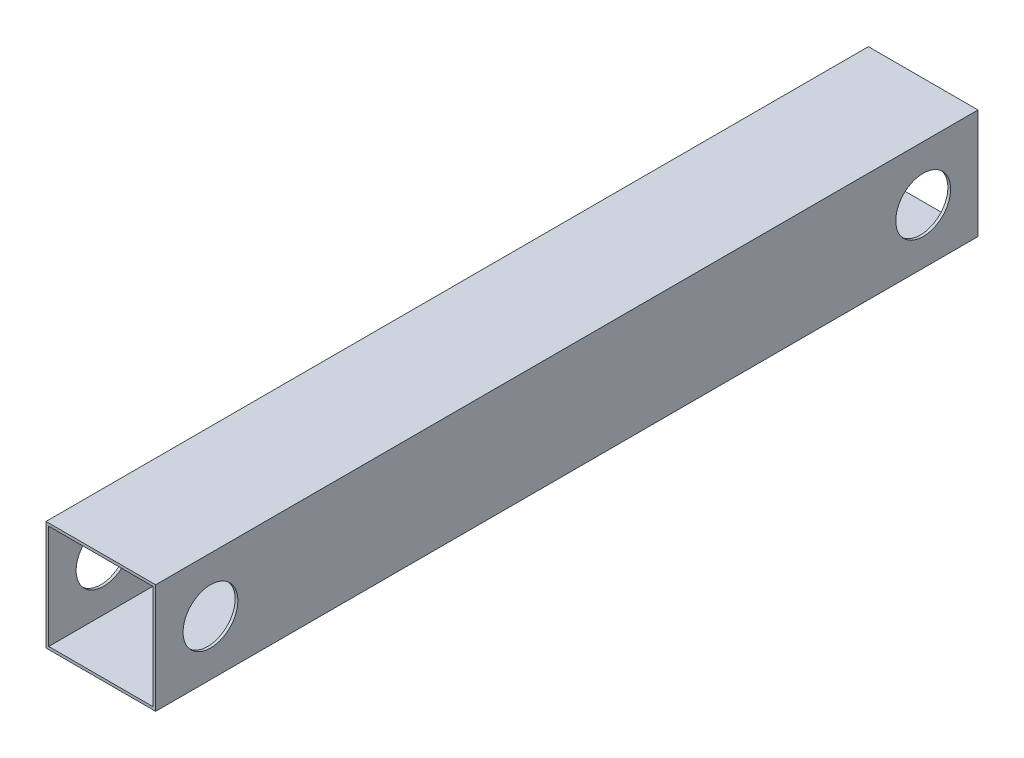
ISO-10303-21;
HEADER;
FILE_DESCRIPTION(('STEP AP214'),'2;1');
FILE_NAME('part.step','',(''),(''),'','','');
FILE_SCHEMA(('AUTOMOTIVE_DESIGN { 1 0 10303 214 1 1 1 1 }'));
ENDSEC;
DATA;
#1=APPLICATION_CONTEXT('core data for automotive mechanical design processes');
#2=APPLICATION_PROTOCOL_DEFINITION('international standard','automotive_design',2000,#1);
#3=PRODUCT_CONTEXT('',#1,'mechanical');
#4=PRODUCT('Part','Part','',(#3));
#5=PRODUCT_RELATED_PRODUCT_CATEGORY('part','',(#4));
#6=PRODUCT_DEFINITION_FORMATION('','',#4);
#7=PRODUCT_DEFINITION_CONTEXT('part definition',#1,'design');
#8=PRODUCT_DEFINITION('design','',#6,#7);
#9=PRODUCT_DEFINITION_SHAPE('','',#8);
#10=(LENGTH_UNIT() NAMED_UNIT(*) SI_UNIT(.MILLI.,.METRE.));
#11=(NAMED_UNIT(*) PLANE_ANGLE_UNIT() SI_UNIT($,.RADIAN.));
#12=(NAMED_UNIT(*) SI_UNIT($,.STERADIAN.) SOLID_ANGLE_UNIT());
#13=UNCERTAINTY_MEASURE_WITH_UNIT(LENGTH_MEASURE(1.E-05),#10,'distance_accuracy_value','');
#14=(GEOMETRIC_REPRESENTATION_CONTEXT(3) GLOBAL_UNCERTAINTY_ASSIGNED_CONTEXT((#13)) GLOBAL_UNIT_ASSIGNED_CONTEXT((#10,
#11,#12)) REPRESENTATION_CONTEXT('',''));
#15=CARTESIAN_POINT('',(0.,0.,0.));
#16=DIRECTION('',(0.,0.,1.));
#17=DIRECTION('',(1.,0.,0.));
#18=AXIS2_PLACEMENT_3D('',#15,#16,#17);
#19=CARTESIAN_POINT('',(0.,0.,150.));
#20=DIRECTION('',(0.,0.,-1.));
#21=DIRECTION('',(-1.,0.,0.));
#22=AXIS2_PLACEMENT_3D('',#19,#20,#21);
#23=PLANE('',#22);
#24=DIRECTION('',(0.,1.,0.));
#25=VECTOR('',#24,1.);
#26=CARTESIAN_POINT('',(10.,-10.,150.));
#27=LINE('',#26,#25);
#28=CARTESIAN_POINT('',(10.,-10.,150.));
#29=VERTEX_POINT('',#28);
#30=CARTESIAN_POINT('',(10.,10.,150.));
#31=VERTEX_POINT('',#30);
#32=EDGE_CURVE('E157',#29,#31,#27,.T.);
#33=ORIENTED_EDGE('',*,*,#32,.T.);
#34=DIRECTION('',(-1.,0.,0.));
#35=VECTOR('',#34,1.);
#36=CARTESIAN_POINT('',(-10.,10.,150.));
#37=LINE('',#36,#35);
#38=CARTESIAN_POINT('',(-10.,10.,150.));
#39=VERTEX_POINT('',#38);
#40=EDGE_CURVE('E161',#31,#39,#37,.T.);
#41=ORIENTED_EDGE('',*,*,#40,.T.);
#42=DIRECTION('',(0.,-1.,0.));
#43=VECTOR('',#42,1.);
#44=CARTESIAN_POINT('',(-10.,-10.,150.));
#45=LINE('',#44,#43);
#46=CARTESIAN_POINT('',(-10.,-10.,150.));
#47=VERTEX_POINT('',#46);
#48=EDGE_CURVE('E165',#39,#47,#45,.T.);
#49=ORIENTED_EDGE('',*,*,#48,.T.);
#50=DIRECTION('',(1.,0.,0.));
#51=VECTOR('',#50,1.);
#52=CARTESIAN_POINT('',(-10.,-10.,150.));
#53=LINE('',#52,#51);
#54=EDGE_CURVE('E168',#47,#29,#53,.T.);
#55=ORIENTED_EDGE('',*,*,#54,.T.);
#56=EDGE_LOOP('',(#33,#41,#49,#55));
#57=FACE_BOUND('',#56,.T.);
#58=DIRECTION('',(0.,1.,0.));
#59=VECTOR('',#58,1.);
#60=CARTESIAN_POINT('',(9.5,-9.5,150.));
#61=LINE('',#60,#59);
#62=CARTESIAN_POINT('',(9.5,-9.5,150.));
#63=VERTEX_POINT('',#62);
#64=CARTESIAN_POINT('',(9.5,9.5,150.));
#65=VERTEX_POINT('',#64);
#66=EDGE_CURVE('E107',#63,#65,#61,.T.);
#67=ORIENTED_EDGE('',*,*,#66,.F.);
#68=DIRECTION('',(1.,0.,0.));
#69=VECTOR('',#68,1.);
#70=CARTESIAN_POINT('',(-9.5,-9.5,150.));
#71=LINE('',#70,#69);
#72=CARTESIAN_POINT('',(-9.5,-9.5,150.));
#73=VERTEX_POINT('',#72);
#74=EDGE_CURVE('E133',#73,#63,#71,.T.);
#75=ORIENTED_EDGE('',*,*,#74,.F.);
#76=DIRECTION('',(0.,-1.,0.));
#77=VECTOR('',#76,1.);
#78=CARTESIAN_POINT('',(-9.5,-9.5,150.));
#79=LINE('',#78,#77);
#80=CARTESIAN_POINT('',(-9.5,9.5,150.));
#81=VERTEX_POINT('',#80);
#82=EDGE_CURVE('E129',#81,#73,#79,.T.);
#83=ORIENTED_EDGE('',*,*,#82,.F.);
#84=DIRECTION('',(-1.,0.,0.));
#85=VECTOR('',#84,1.);
#86=CARTESIAN_POINT('',(-9.5,9.5,150.));
#87=LINE('',#86,#85);
#88=EDGE_CURVE('E116',#65,#81,#87,.T.);
#89=ORIENTED_EDGE('',*,*,#88,.F.);
#90=EDGE_LOOP('',(#67,#75,#83,#89));
#91=FACE_BOUND('',#90,.T.);
#92=ADVANCED_FACE('F39',(#57,#91),#23,.F.);
#93=CARTESIAN_POINT('',(0.,0.,0.));
#94=DIRECTION('',(0.,0.,-1.));
#95=DIRECTION('',(-1.,0.,0.));
#96=AXIS2_PLACEMENT_3D('',#93,#94,#95);
#97=PLANE('',#96);
#98=DIRECTION('',(0.,1.,0.));
#99=VECTOR('',#98,1.);
#100=CARTESIAN_POINT('',(10.,-10.,0.));
#101=LINE('',#100,#99);
#102=CARTESIAN_POINT('',(10.,-10.,0.));
#103=VERTEX_POINT('',#102);
#104=CARTESIAN_POINT('',(10.,10.,0.));
#105=VERTEX_POINT('',#104);
#106=EDGE_CURVE('E125',#103,#105,#101,.T.);
#107=ORIENTED_EDGE('',*,*,#106,.F.);
#108=DIRECTION('',(1.,0.,0.));
#109=VECTOR('',#108,1.);
#110=CARTESIAN_POINT('',(-10.,-10.,0.));
#111=LINE('',#110,#109);
#112=CARTESIAN_POINT('',(-10.,-10.,0.));
#113=VERTEX_POINT('',#112);
#114=EDGE_CURVE('E162',#113,#103,#111,.T.);
#115=ORIENTED_EDGE('',*,*,#114,.F.);
#116=DIRECTION('',(0.,-1.,0.));
#117=VECTOR('',#116,1.);
#118=CARTESIAN_POINT('',(-10.,-10.,0.));
#119=LINE('',#118,#117);
#120=CARTESIAN_POINT('',(-10.,10.,0.));
#121=VERTEX_POINT('',#120);
#122=EDGE_CURVE('E178',#121,#113,#119,.T.);
#123=ORIENTED_EDGE('',*,*,#122,.F.);
#124=DIRECTION('',(-1.,0.,0.));
#125=VECTOR('',#124,1.);
#126=CARTESIAN_POINT('',(-10.,10.,0.));
#127=LINE('',#126,#125);
#128=EDGE_CURVE('E175',#105,#121,#127,.T.);
#129=ORIENTED_EDGE('',*,*,#128,.F.);
#130=EDGE_LOOP('',(#107,#115,#123,#129));
#131=FACE_BOUND('',#130,.T.);
#132=DIRECTION('',(1.,0.,0.));
#133=VECTOR('',#132,1.);
#134=CARTESIAN_POINT('',(-9.5,-9.5,0.));
#135=LINE('',#134,#133);
#136=CARTESIAN_POINT('',(-9.5,-9.5,0.));
#137=VERTEX_POINT('',#136);
#138=CARTESIAN_POINT('',(9.5,-9.5,0.));
#139=VERTEX_POINT('',#138);
#140=EDGE_CURVE('E117',#137,#139,#135,.T.);
#141=ORIENTED_EDGE('',*,*,#140,.T.);
#142=DIRECTION('',(0.,1.,0.));
#143=VECTOR('',#142,1.);
#144=CARTESIAN_POINT('',(9.5,-9.5,0.));
#145=LINE('',#144,#143);
#146=CARTESIAN_POINT('',(9.5,9.5,0.));
#147=VERTEX_POINT('',#146);
#148=EDGE_CURVE('E65',#139,#147,#145,.T.);
#149=ORIENTED_EDGE('',*,*,#148,.T.);
#150=DIRECTION('',(-1.,0.,0.));
#151=VECTOR('',#150,1.);
#152=CARTESIAN_POINT('',(-9.5,9.5,0.));
#153=LINE('',#152,#151);
#154=CARTESIAN_POINT('',(-9.5,9.5,0.));
#155=VERTEX_POINT('',#154);
#156=EDGE_CURVE('E123',#147,#155,#153,.T.);
#157=ORIENTED_EDGE('',*,*,#156,.T.);
#158=DIRECTION('',(0.,-1.,0.));
#159=VECTOR('',#158,1.);
#160=CARTESIAN_POINT('',(-9.5,-9.5,0.));
#161=LINE('',#160,#159);
#162=EDGE_CURVE('E144',#155,#137,#161,.T.);
#163=ORIENTED_EDGE('',*,*,#162,.T.);
#164=EDGE_LOOP('',(#141,#149,#157,#163));
#165=FACE_BOUND('',#164,.T.);
#166=ADVANCED_FACE('F244',(#131,#165),#97,.T.);
#167=CARTESIAN_POINT('',(10.,-10.,150.));
#168=DIRECTION('',(-1.,0.,0.));
#169=DIRECTION('',(0.,0.,1.));
#170=AXIS2_PLACEMENT_3D('',#167,#168,#169);
#171=PLANE('',#170);
#172=CARTESIAN_POINT('',(10.,0.,140.));
#173=DIRECTION('',(1.,0.,0.));
#174=DIRECTION('',(0.,0.,-1.));
#175=AXIS2_PLACEMENT_3D('',#172,#173,#174);
#176=CIRCLE('',#175,4.99999999999999);
#177=CARTESIAN_POINT('',(10.,0.,135.));
#178=VERTEX_POINT('',#177);
#179=EDGE_CURVE('E196',#178,#178,#176,.T.);
#180=ORIENTED_EDGE('',*,*,#179,.F.);
#181=EDGE_LOOP('',(#180));
#182=FACE_BOUND('',#181,.T.);
#183=CARTESIAN_POINT('',(10.,0.,10.));
#184=DIRECTION('',(1.,0.,0.));
#185=DIRECTION('',(0.,0.,1.));
#186=AXIS2_PLACEMENT_3D('',#183,#184,#185);
#187=CIRCLE('',#186,4.99999999999999);
#188=CARTESIAN_POINT('',(10.,0.,15.));
#189=VERTEX_POINT('',#188);
#190=EDGE_CURVE('E205',#189,#189,#187,.T.);
#191=ORIENTED_EDGE('',*,*,#190,.F.);
#192=EDGE_LOOP('',(#191));
#193=FACE_BOUND('',#192,.T.);
#194=ORIENTED_EDGE('',*,*,#106,.T.);
#195=DIRECTION('',(0.,0.,-1.));
#196=VECTOR('',#195,1.);
#197=CARTESIAN_POINT('',(10.,10.,150.));
#198=LINE('',#197,#196);
#199=EDGE_CURVE('E11',#31,#105,#198,.T.);
#200=ORIENTED_EDGE('',*,*,#199,.F.);
#201=ORIENTED_EDGE('',*,*,#32,.F.);
#202=DIRECTION('',(0.,0.,-1.));
#203=VECTOR('',#202,1.);
#204=CARTESIAN_POINT('',(10.,-10.,150.));
#205=LINE('',#204,#203);
#206=EDGE_CURVE('E171',#29,#103,#205,.T.);
#207=ORIENTED_EDGE('',*,*,#206,.T.);
#208=EDGE_LOOP('',(#194,#200,#201,#207));
#209=FACE_BOUND('',#208,.T.);
#210=ADVANCED_FACE('F41',(#182,#193,#209),#171,.F.);
#211=CARTESIAN_POINT('',(-10.,10.,150.));
#212=DIRECTION('',(0.,-1.,0.));
#213=DIRECTION('',(0.,0.,-1.));
#214=AXIS2_PLACEMENT_3D('',#211,#212,#213);
#215=PLANE('',#214);
#216=ORIENTED_EDGE('',*,*,#128,.T.);
#217=DIRECTION('',(0.,0.,-1.));
#218=VECTOR('',#217,1.);
#219=CARTESIAN_POINT('',(-10.,10.,150.));
#220=LINE('',#219,#218);
#221=EDGE_CURVE('E49',#39,#121,#220,.T.);
#222=ORIENTED_EDGE('',*,*,#221,.F.);
#223=ORIENTED_EDGE('',*,*,#40,.F.);
#224=ORIENTED_EDGE('',*,*,#199,.T.);
#225=EDGE_LOOP('',(#216,#222,#223,#224));
#226=FACE_BOUND('',#225,.T.);
#227=ADVANCED_FACE('F260',(#226),#215,.F.);
#228=CARTESIAN_POINT('',(-10.,-10.,150.));
#229=DIRECTION('',(1.,0.,0.));
#230=DIRECTION('',(0.,0.,-1.));
#231=AXIS2_PLACEMENT_3D('',#228,#229,#230);
#232=PLANE('',#231);
#233=CARTESIAN_POINT('',(-10.,0.,140.));
#234=DIRECTION('',(1.,0.,0.));
#235=DIRECTION('',(0.,0.,-1.));
#236=AXIS2_PLACEMENT_3D('',#233,#234,#235);
#237=CIRCLE('',#236,4.99999999999999);
#238=CARTESIAN_POINT('',(-10.,0.,135.));
#239=VERTEX_POINT('',#238);
#240=EDGE_CURVE('E141',#239,#239,#237,.T.);
#241=ORIENTED_EDGE('',*,*,#240,.T.);
#242=EDGE_LOOP('',(#241));
#243=FACE_BOUND('',#242,.T.);
#244=CARTESIAN_POINT('',(-10.,0.,10.));
#245=DIRECTION('',(1.,0.,0.));
#246=DIRECTION('',(0.,0.,-1.));
#247=AXIS2_PLACEMENT_3D('',#244,#245,#246);
#248=CIRCLE('',#247,4.99999999999999);
#249=CARTESIAN_POINT('',(-10.,0.,5.00000000000002));
#250=VERTEX_POINT('',#249);
#251=EDGE_CURVE('E202',#250,#250,#248,.T.);
#252=ORIENTED_EDGE('',*,*,#251,.T.);
#253=EDGE_LOOP('',(#252));
#254=FACE_BOUND('',#253,.T.);
#255=ORIENTED_EDGE('',*,*,#122,.T.);
#256=DIRECTION('',(0.,0.,-1.));
#257=VECTOR('',#256,1.);
#258=CARTESIAN_POINT('',(-10.,-10.,150.));
#259=LINE('',#258,#257);
#260=EDGE_CURVE('E186',#47,#113,#259,.T.);
#261=ORIENTED_EDGE('',*,*,#260,.F.);
#262=ORIENTED_EDGE('',*,*,#48,.F.);
#263=ORIENTED_EDGE('',*,*,#221,.T.);
#264=EDGE_LOOP('',(#255,#261,#262,#263));
#265=FACE_BOUND('',#264,.T.);
#266=ADVANCED_FACE('F223',(#243,#254,#265),#232,.F.);
#267=CARTESIAN_POINT('',(-10.,-10.,150.));
#268=DIRECTION('',(0.,1.,0.));
#269=DIRECTION('',(0.,0.,1.));
#270=AXIS2_PLACEMENT_3D('',#267,#268,#269);
#271=PLANE('',#270);
#272=ORIENTED_EDGE('',*,*,#114,.T.);
#273=ORIENTED_EDGE('',*,*,#206,.F.);
#274=ORIENTED_EDGE('',*,*,#54,.F.);
#275=ORIENTED_EDGE('',*,*,#260,.T.);
#276=EDGE_LOOP('',(#272,#273,#274,#275));
#277=FACE_BOUND('',#276,.T.);
#278=ADVANCED_FACE('F255',(#277),#271,.F.);
#279=CARTESIAN_POINT('',(9.5,-9.5,150.));
#280=DIRECTION('',(-1.,0.,0.));
#281=DIRECTION('',(0.,0.,1.));
#282=AXIS2_PLACEMENT_3D('',#279,#280,#281);
#283=PLANE('',#282);
#284=CARTESIAN_POINT('',(9.50000000000001,0.,140.));
#285=DIRECTION('',(-1.,0.,0.));
#286=DIRECTION('',(0.,0.,1.));
#287=AXIS2_PLACEMENT_3D('',#284,#285,#286);
#288=CIRCLE('',#287,4.99999999999999);
#289=CARTESIAN_POINT('',(9.50000000000001,0.,145.));
#290=VERTEX_POINT('',#289);
#291=EDGE_CURVE('E216',#290,#290,#288,.T.);
#292=ORIENTED_EDGE('',*,*,#291,.F.);
#293=EDGE_LOOP('',(#292));
#294=FACE_BOUND('',#293,.T.);
#295=CARTESIAN_POINT('',(9.50000000000001,0.,10.));
#296=DIRECTION('',(-1.,0.,0.));
#297=DIRECTION('',(0.,0.,1.));
#298=AXIS2_PLACEMENT_3D('',#295,#296,#297);
#299=CIRCLE('',#298,4.99999999999999);
#300=CARTESIAN_POINT('',(9.50000000000001,0.,15.));
#301=VERTEX_POINT('',#300);
#302=EDGE_CURVE('E195',#301,#301,#299,.T.);
#303=ORIENTED_EDGE('',*,*,#302,.F.);
#304=EDGE_LOOP('',(#303));
#305=FACE_BOUND('',#304,.T.);
#306=ORIENTED_EDGE('',*,*,#148,.F.);
#307=DIRECTION('',(0.,0.,-1.));
#308=VECTOR('',#307,1.);
#309=CARTESIAN_POINT('',(9.5,-9.5,150.));
#310=LINE('',#309,#308);
#311=EDGE_CURVE('E111',#63,#139,#310,.T.);
#312=ORIENTED_EDGE('',*,*,#311,.F.);
#313=ORIENTED_EDGE('',*,*,#66,.T.);
#314=DIRECTION('',(0.,0.,-1.));
#315=VECTOR('',#314,1.);
#316=CARTESIAN_POINT('',(9.5,9.5,150.));
#317=LINE('',#316,#315);
#318=EDGE_CURVE('E110',#65,#147,#317,.T.);
#319=ORIENTED_EDGE('',*,*,#318,.T.);
#320=EDGE_LOOP('',(#306,#312,#313,#319));
#321=FACE_BOUND('',#320,.T.);
#322=ADVANCED_FACE('F109',(#294,#305,#321),#283,.T.);
#323=CARTESIAN_POINT('',(-9.5,9.5,150.));
#324=DIRECTION('',(0.,-1.,0.));
#325=DIRECTION('',(0.,0.,-1.));
#326=AXIS2_PLACEMENT_3D('',#323,#324,#325);
#327=PLANE('',#326);
#328=ORIENTED_EDGE('',*,*,#156,.F.);
#329=ORIENTED_EDGE('',*,*,#318,.F.);
#330=ORIENTED_EDGE('',*,*,#88,.T.);
#331=DIRECTION('',(0.,0.,-1.));
#332=VECTOR('',#331,1.);
#333=CARTESIAN_POINT('',(-9.5,9.5,150.));
#334=LINE('',#333,#332);
#335=EDGE_CURVE('E126',#81,#155,#334,.T.);
#336=ORIENTED_EDGE('',*,*,#335,.T.);
#337=EDGE_LOOP('',(#328,#329,#330,#336));
#338=FACE_BOUND('',#337,.T.);
#339=ADVANCED_FACE('F120',(#338),#327,.T.);
#340=CARTESIAN_POINT('',(-9.5,-9.5,150.));
#341=DIRECTION('',(1.,0.,0.));
#342=DIRECTION('',(0.,0.,-1.));
#343=AXIS2_PLACEMENT_3D('',#340,#341,#342);
#344=PLANE('',#343);
#345=CARTESIAN_POINT('',(-9.50000000000001,0.,140.));
#346=DIRECTION('',(1.,0.,0.));
#347=DIRECTION('',(0.,0.,-1.));
#348=AXIS2_PLACEMENT_3D('',#345,#346,#347);
#349=CIRCLE('',#348,4.99999999999999);
#350=CARTESIAN_POINT('',(-9.50000000000001,0.,135.));
#351=VERTEX_POINT('',#350);
#352=EDGE_CURVE('E43',#351,#351,#349,.T.);
#353=ORIENTED_EDGE('',*,*,#352,.F.);
#354=EDGE_LOOP('',(#353));
#355=FACE_BOUND('',#354,.T.);
#356=CARTESIAN_POINT('',(-9.50000000000001,0.,10.));
#357=DIRECTION('',(1.,0.,0.));
#358=DIRECTION('',(0.,0.,-1.));
#359=AXIS2_PLACEMENT_3D('',#356,#357,#358);
#360=CIRCLE('',#359,4.99999999999999);
#361=CARTESIAN_POINT('',(-9.50000000000001,0.,5.00000000000002));
#362=VERTEX_POINT('',#361);
#363=EDGE_CURVE('E192',#362,#362,#360,.T.);
#364=ORIENTED_EDGE('',*,*,#363,.F.);
#365=EDGE_LOOP('',(#364));
#366=FACE_BOUND('',#365,.T.);
#367=ORIENTED_EDGE('',*,*,#162,.F.);
#368=ORIENTED_EDGE('',*,*,#335,.F.);
#369=ORIENTED_EDGE('',*,*,#82,.T.);
#370=DIRECTION('',(0.,0.,-1.));
#371=VECTOR('',#370,1.);
#372=CARTESIAN_POINT('',(-9.5,-9.5,150.));
#373=LINE('',#372,#371);
#374=EDGE_CURVE('E57',#73,#137,#373,.T.);
#375=ORIENTED_EDGE('',*,*,#374,.T.);
#376=EDGE_LOOP('',(#367,#368,#369,#375));
#377=FACE_BOUND('',#376,.T.);
#378=ADVANCED_FACE('F282',(#355,#366,#377),#344,.T.);
#379=CARTESIAN_POINT('',(-9.5,-9.5,150.));
#380=DIRECTION('',(0.,1.,0.));
#381=DIRECTION('',(0.,0.,1.));
#382=AXIS2_PLACEMENT_3D('',#379,#380,#381);
#383=PLANE('',#382);
#384=ORIENTED_EDGE('',*,*,#140,.F.);
#385=ORIENTED_EDGE('',*,*,#374,.F.);
#386=ORIENTED_EDGE('',*,*,#74,.T.);
#387=ORIENTED_EDGE('',*,*,#311,.T.);
#388=EDGE_LOOP('',(#384,#385,#386,#387));
#389=FACE_BOUND('',#388,.T.);
#390=ADVANCED_FACE('F239',(#389),#383,.T.);
#391=CARTESIAN_POINT('',(-140.,0.,10.));
#392=DIRECTION('',(1.,0.,0.));
#393=DIRECTION('',(0.,0.,-1.));
#394=AXIS2_PLACEMENT_3D('',#391,#392,#393);
#395=CYLINDRICAL_SURFACE('',#394,4.99999999999999);
#396=ORIENTED_EDGE('',*,*,#363,.T.);
#397=EDGE_LOOP('',(#396));
#398=FACE_BOUND('',#397,.T.);
#399=ORIENTED_EDGE('',*,*,#251,.F.);
#400=EDGE_LOOP('',(#399));
#401=FACE_BOUND('',#400,.T.);
#402=ADVANCED_FACE('F229',(#398,#401),#395,.F.);
#403=CARTESIAN_POINT('',(-140.,0.,140.));
#404=DIRECTION('',(1.,0.,0.));
#405=DIRECTION('',(0.,0.,-1.));
#406=AXIS2_PLACEMENT_3D('',#403,#404,#405);
#407=CYLINDRICAL_SURFACE('',#406,4.99999999999999);
#408=ORIENTED_EDGE('',*,*,#352,.T.);
#409=EDGE_LOOP('',(#408));
#410=FACE_BOUND('',#409,.T.);
#411=ORIENTED_EDGE('',*,*,#240,.F.);
#412=EDGE_LOOP('',(#411));
#413=FACE_BOUND('',#412,.T.);
#414=ADVANCED_FACE('F226',(#410,#413),#407,.F.);
#415=ORIENTED_EDGE('',*,*,#302,.T.);
#416=EDGE_LOOP('',(#415));
#417=FACE_BOUND('',#416,.T.);
#418=ORIENTED_EDGE('',*,*,#190,.T.);
#419=EDGE_LOOP('',(#418));
#420=FACE_BOUND('',#419,.T.);
#421=ADVANCED_FACE('F228',(#417,#420),#395,.F.);
#422=ORIENTED_EDGE('',*,*,#291,.T.);
#423=EDGE_LOOP('',(#422));
#424=FACE_BOUND('',#423,.T.);
#425=ORIENTED_EDGE('',*,*,#179,.T.);
#426=EDGE_LOOP('',(#425));
#427=FACE_BOUND('',#426,.T.);
#428=ADVANCED_FACE('F232',(#424,#427),#407,.F.);
#429=CLOSED_SHELL('',(#92,#166,#210,#227,#266,#278,#322,#339,#378,#390,#402,#414,#421,#428));
#430=MANIFOLD_SOLID_BREP('B2',#429);
#431=ADVANCED_BREP_SHAPE_REPRESENTATION('',(#18,#430),#14);
#432=SHAPE_DEFINITION_REPRESENTATION(#9,#431);
ENDSEC;
END-ISO-10303-21;
